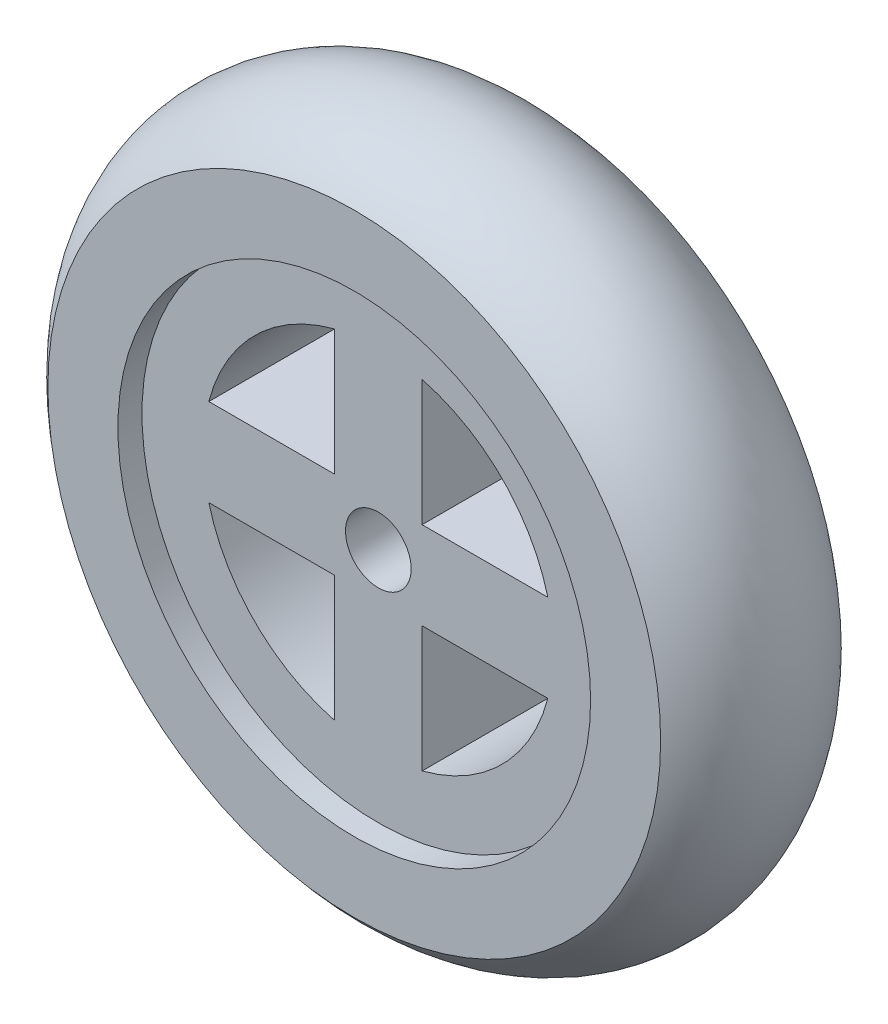
ISO-10303-21;
HEADER;
FILE_DESCRIPTION(('STEP AP214'),'2;1');
FILE_NAME('part.step','',(''),(''),'','','');
FILE_SCHEMA(('AUTOMOTIVE_DESIGN { 1 0 10303 214 1 1 1 1 }'));
ENDSEC;
DATA;
#1=APPLICATION_CONTEXT('core data for automotive mechanical design processes');
#2=APPLICATION_PROTOCOL_DEFINITION('international standard','automotive_design',2000,#1);
#3=PRODUCT_CONTEXT('',#1,'mechanical');
#4=PRODUCT('Part','Part','',(#3));
#5=PRODUCT_RELATED_PRODUCT_CATEGORY('part','',(#4));
#6=PRODUCT_DEFINITION_FORMATION('','',#4);
#7=PRODUCT_DEFINITION_CONTEXT('part definition',#1,'design');
#8=PRODUCT_DEFINITION('design','',#6,#7);
#9=PRODUCT_DEFINITION_SHAPE('','',#8);
#10=(LENGTH_UNIT() NAMED_UNIT(*) SI_UNIT(.MILLI.,.METRE.));
#11=(NAMED_UNIT(*) PLANE_ANGLE_UNIT() SI_UNIT($,.RADIAN.));
#12=(NAMED_UNIT(*) SI_UNIT($,.STERADIAN.) SOLID_ANGLE_UNIT());
#13=UNCERTAINTY_MEASURE_WITH_UNIT(LENGTH_MEASURE(1.E-05),#10,'distance_accuracy_value','');
#14=(GEOMETRIC_REPRESENTATION_CONTEXT(3) GLOBAL_UNCERTAINTY_ASSIGNED_CONTEXT((#13)) GLOBAL_UNIT_ASSIGNED_CONTEXT((#10,
#11,#12)) REPRESENTATION_CONTEXT('',''));
#15=CARTESIAN_POINT('',(0.,0.,0.));
#16=DIRECTION('',(0.,0.,1.));
#17=DIRECTION('',(1.,0.,0.));
#18=AXIS2_PLACEMENT_3D('',#15,#16,#17);
#19=CARTESIAN_POINT('',(2.44635933818074E-11,0.,7131.7252449469));
#20=DIRECTION('',(0.,0.,1.));
#21=DIRECTION('',(1.,0.,0.));
#22=AXIS2_PLACEMENT_3D('',#19,#20,#21);
#23=CYLINDRICAL_SURFACE('',#22,40.);
#24=CARTESIAN_POINT('',(0.,0.,-14.9999999999997));
#25=DIRECTION('',(0.,0.,1.));
#26=DIRECTION('',(1.,0.,0.));
#27=AXIS2_PLACEMENT_3D('',#24,#25,#26);
#28=CIRCLE('',#27,40.0000000000001);
#29=CARTESIAN_POINT('',(-10.,38.7298334620742,-15.));
#30=VERTEX_POINT('',#29);
#31=CARTESIAN_POINT('',(-38.7298334620743,10.,-14.9999999999995));
#32=VERTEX_POINT('',#31);
#33=EDGE_CURVE('E206',#30,#32,#28,.T.);
#34=ORIENTED_EDGE('',*,*,#33,.F.);
#35=DIRECTION('',(0.,0.,1.));
#36=VECTOR('',#35,1.);
#37=CARTESIAN_POINT('',(-10.,38.7298334620679,7131.7252449469));
#38=LINE('',#37,#36);
#39=CARTESIAN_POINT('',(-9.99999999999999,38.7298334620741,14.9999999999997));
#40=VERTEX_POINT('',#39);
#41=EDGE_CURVE('E255',#30,#40,#38,.T.);
#42=ORIENTED_EDGE('',*,*,#41,.T.);
#43=CARTESIAN_POINT('',(0.,0.,14.9999999999997));
#44=DIRECTION('',(0.,0.,1.));
#45=DIRECTION('',(1.,0.,0.));
#46=AXIS2_PLACEMENT_3D('',#43,#44,#45);
#47=CIRCLE('',#46,40.);
#48=CARTESIAN_POINT('',(-38.7298334620741,9.99999999999997,14.9999999999998));
#49=VERTEX_POINT('',#48);
#50=EDGE_CURVE('E211',#40,#49,#47,.T.);
#51=ORIENTED_EDGE('',*,*,#50,.T.);
#52=DIRECTION('',(0.,0.,1.));
#53=VECTOR('',#52,1.);
#54=CARTESIAN_POINT('',(-38.7298334620497,10.,7131.7252449469));
#55=LINE('',#54,#53);
#56=EDGE_CURVE('E171',#49,#32,#55,.F.);
#57=ORIENTED_EDGE('',*,*,#56,.T.);
#58=EDGE_LOOP('',(#34,#42,#51,#57));
#59=FACE_BOUND('',#58,.T.);
#60=ADVANCED_FACE('F39',(#59),#23,.F.);
#61=CARTESIAN_POINT('',(-38.7298334620741,-9.99999999999997,14.9999999999998));
#62=VERTEX_POINT('',#61);
#63=CARTESIAN_POINT('',(-10.,-38.7298334620679,15.));
#64=VERTEX_POINT('',#63);
#65=EDGE_CURVE('E208',#62,#64,#47,.T.);
#66=ORIENTED_EDGE('',*,*,#65,.T.);
#67=DIRECTION('',(0.,0.,1.));
#68=VECTOR('',#67,1.);
#69=CARTESIAN_POINT('',(-10.,-38.7298334620679,7131.7252449469));
#70=LINE('',#69,#68);
#71=CARTESIAN_POINT('',(-10.,-38.7298334620742,-14.9999999999996));
#72=VERTEX_POINT('',#71);
#73=EDGE_CURVE('E241',#64,#72,#70,.F.);
#74=ORIENTED_EDGE('',*,*,#73,.T.);
#75=CARTESIAN_POINT('',(-38.7298334620743,-10.,-15.));
#76=VERTEX_POINT('',#75);
#77=EDGE_CURVE('E144',#76,#72,#28,.T.);
#78=ORIENTED_EDGE('',*,*,#77,.F.);
#79=DIRECTION('',(0.,0.,1.));
#80=VECTOR('',#79,1.);
#81=CARTESIAN_POINT('',(-38.7298334620497,-10.,7131.7252449469));
#82=LINE('',#81,#80);
#83=EDGE_CURVE('E150',#62,#76,#82,.F.);
#84=ORIENTED_EDGE('',*,*,#83,.F.);
#85=EDGE_LOOP('',(#66,#74,#78,#84));
#86=FACE_BOUND('',#85,.T.);
#87=ADVANCED_FACE('F333',(#86),#23,.F.);
#88=CARTESIAN_POINT('',(0.,10.,0.));
#89=DIRECTION('',(0.,-1.,0.));
#90=DIRECTION('',(0.,0.,-1.));
#91=AXIS2_PLACEMENT_3D('',#88,#89,#90);
#92=PLANE('',#91);
#93=DIRECTION('',(0.,0.,1.));
#94=VECTOR('',#93,1.);
#95=CARTESIAN_POINT('',(-10.,10.,0.));
#96=LINE('',#95,#94);
#97=CARTESIAN_POINT('',(-10.,10.,-15.));
#98=VERTEX_POINT('',#97);
#99=CARTESIAN_POINT('',(-10.,10.,15.));
#100=VERTEX_POINT('',#99);
#101=EDGE_CURVE('E236',#98,#100,#96,.T.);
#102=ORIENTED_EDGE('',*,*,#101,.F.);
#103=DIRECTION('',(1.,0.,0.));
#104=VECTOR('',#103,1.);
#105=CARTESIAN_POINT('',(-40.,10.,-15.));
#106=LINE('',#105,#104);
#107=EDGE_CURVE('E167',#32,#98,#106,.T.);
#108=ORIENTED_EDGE('',*,*,#107,.F.);
#109=ORIENTED_EDGE('',*,*,#56,.F.);
#110=DIRECTION('',(1.,0.,0.));
#111=VECTOR('',#110,1.);
#112=CARTESIAN_POINT('',(-40.,10.,15.));
#113=LINE('',#112,#111);
#114=EDGE_CURVE('E157',#49,#100,#113,.T.);
#115=ORIENTED_EDGE('',*,*,#114,.T.);
#116=EDGE_LOOP('',(#102,#108,#109,#115));
#117=FACE_BOUND('',#116,.T.);
#118=ADVANCED_FACE('F290',(#117),#92,.F.);
#119=CARTESIAN_POINT('',(0.,-10.,0.));
#120=DIRECTION('',(0.,-1.,0.));
#121=DIRECTION('',(0.,0.,-1.));
#122=AXIS2_PLACEMENT_3D('',#119,#120,#121);
#123=PLANE('',#122);
#124=DIRECTION('',(1.,0.,0.));
#125=VECTOR('',#124,1.);
#126=CARTESIAN_POINT('',(-40.,-10.,-15.));
#127=LINE('',#126,#125);
#128=CARTESIAN_POINT('',(-10.,-10.,-15.));
#129=VERTEX_POINT('',#128);
#130=EDGE_CURVE('E143',#76,#129,#127,.T.);
#131=ORIENTED_EDGE('',*,*,#130,.T.);
#132=DIRECTION('',(0.,0.,1.));
#133=VECTOR('',#132,1.);
#134=CARTESIAN_POINT('',(-10.,-10.,0.));
#135=LINE('',#134,#133);
#136=CARTESIAN_POINT('',(-10.,-10.,15.));
#137=VERTEX_POINT('',#136);
#138=EDGE_CURVE('E49',#129,#137,#135,.T.);
#139=ORIENTED_EDGE('',*,*,#138,.T.);
#140=DIRECTION('',(1.,0.,0.));
#141=VECTOR('',#140,1.);
#142=CARTESIAN_POINT('',(-40.,-10.,15.));
#143=LINE('',#142,#141);
#144=EDGE_CURVE('E160',#62,#137,#143,.T.);
#145=ORIENTED_EDGE('',*,*,#144,.F.);
#146=ORIENTED_EDGE('',*,*,#83,.T.);
#147=EDGE_LOOP('',(#131,#139,#145,#146));
#148=FACE_BOUND('',#147,.T.);
#149=ADVANCED_FACE('F149',(#148),#123,.T.);
#150=DIRECTION('',(0.,0.,1.));
#151=VECTOR('',#150,1.);
#152=CARTESIAN_POINT('',(10.,38.7298334620805,7131.7252449469));
#153=LINE('',#152,#151);
#154=CARTESIAN_POINT('',(10.,38.7298334620742,-15.));
#155=VERTEX_POINT('',#154);
#156=CARTESIAN_POINT('',(10.,38.7298334620741,15.));
#157=VERTEX_POINT('',#156);
#158=EDGE_CURVE('E224',#155,#157,#153,.T.);
#159=ORIENTED_EDGE('',*,*,#158,.F.);
#160=CARTESIAN_POINT('',(38.7298334620742,10.,-14.9999999999998));
#161=VERTEX_POINT('',#160);
#162=EDGE_CURVE('E207',#161,#155,#28,.T.);
#163=ORIENTED_EDGE('',*,*,#162,.F.);
#164=DIRECTION('',(0.,0.,1.));
#165=VECTOR('',#164,1.);
#166=CARTESIAN_POINT('',(38.7298334620986,10.,7131.7252449469));
#167=LINE('',#166,#165);
#168=CARTESIAN_POINT('',(38.7298334620742,10.,14.9999999999995));
#169=VERTEX_POINT('',#168);
#170=EDGE_CURVE('E175',#161,#169,#167,.T.);
#171=ORIENTED_EDGE('',*,*,#170,.T.);
#172=EDGE_CURVE('E136',#169,#157,#47,.T.);
#173=ORIENTED_EDGE('',*,*,#172,.T.);
#174=EDGE_LOOP('',(#159,#163,#171,#173));
#175=FACE_BOUND('',#174,.T.);
#176=ADVANCED_FACE('F222',(#175),#23,.F.);
#177=CARTESIAN_POINT('',(54.,0.,15.));
#178=DIRECTION('',(0.,0.,1.));
#179=DIRECTION('',(1.,0.,0.));
#180=AXIS2_PLACEMENT_3D('',#177,#178,#179);
#181=PLANE('',#180);
#182=CARTESIAN_POINT('',(0.,0.,15.0000000000002));
#183=DIRECTION('',(0.,0.,1.));
#184=DIRECTION('',(1.,0.,0.));
#185=AXIS2_PLACEMENT_3D('',#182,#183,#184);
#186=CIRCLE('',#185,7.5);
#187=CARTESIAN_POINT('',(7.5,0.,15.0000000000002));
#188=VERTEX_POINT('',#187);
#189=EDGE_CURVE('E250',#188,#188,#186,.T.);
#190=ORIENTED_EDGE('',*,*,#189,.F.);
#191=EDGE_LOOP('',(#190));
#192=FACE_BOUND('',#191,.T.);
#193=DIRECTION('',(0.,-1.,0.));
#194=VECTOR('',#193,1.);
#195=CARTESIAN_POINT('',(10.,40.,15.));
#196=LINE('',#195,#194);
#197=CARTESIAN_POINT('',(10.,10.,15.));
#198=VERTEX_POINT('',#197);
#199=EDGE_CURVE('E232',#157,#198,#196,.T.);
#200=ORIENTED_EDGE('',*,*,#199,.F.);
#201=ORIENTED_EDGE('',*,*,#172,.F.);
#202=EDGE_CURVE('E152',#198,#169,#113,.T.);
#203=ORIENTED_EDGE('',*,*,#202,.F.);
#204=EDGE_LOOP('',(#200,#201,#203));
#205=FACE_BOUND('',#204,.T.);
#206=ORIENTED_EDGE('',*,*,#50,.F.);
#207=DIRECTION('',(0.,-1.,0.));
#208=VECTOR('',#207,1.);
#209=CARTESIAN_POINT('',(-10.,40.,15.));
#210=LINE('',#209,#208);
#211=EDGE_CURVE('E56',#40,#100,#210,.T.);
#212=ORIENTED_EDGE('',*,*,#211,.T.);
#213=ORIENTED_EDGE('',*,*,#114,.F.);
#214=EDGE_LOOP('',(#206,#212,#213));
#215=FACE_BOUND('',#214,.T.);
#216=CARTESIAN_POINT('',(10.,-38.7298334620805,15.));
#217=VERTEX_POINT('',#216);
#218=CARTESIAN_POINT('',(38.7298334620742,-10.,15.));
#219=VERTEX_POINT('',#218);
#220=EDGE_CURVE('E212',#217,#219,#47,.T.);
#221=ORIENTED_EDGE('',*,*,#220,.F.);
#222=CARTESIAN_POINT('',(10.,-10.,15.));
#223=VERTEX_POINT('',#222);
#224=EDGE_CURVE('E237',#223,#217,#196,.T.);
#225=ORIENTED_EDGE('',*,*,#224,.F.);
#226=EDGE_CURVE('E265',#223,#219,#143,.T.);
#227=ORIENTED_EDGE('',*,*,#226,.T.);
#228=EDGE_LOOP('',(#221,#225,#227));
#229=FACE_BOUND('',#228,.T.);
#230=EDGE_CURVE('E130',#137,#64,#210,.T.);
#231=ORIENTED_EDGE('',*,*,#230,.T.);
#232=ORIENTED_EDGE('',*,*,#65,.F.);
#233=ORIENTED_EDGE('',*,*,#144,.T.);
#234=EDGE_LOOP('',(#231,#232,#233));
#235=FACE_BOUND('',#234,.T.);
#236=CARTESIAN_POINT('',(0.,0.,14.9999999999997));
#237=DIRECTION('',(0.,0.,1.));
#238=DIRECTION('',(1.,0.,0.));
#239=AXIS2_PLACEMENT_3D('',#236,#237,#238);
#240=CIRCLE('',#239,54.);
#241=CARTESIAN_POINT('',(54.,0.,14.9999999999995));
#242=VERTEX_POINT('',#241);
#243=EDGE_CURVE('E179',#242,#242,#240,.T.);
#244=ORIENTED_EDGE('',*,*,#243,.T.);
#245=EDGE_LOOP('',(#244));
#246=FACE_BOUND('',#245,.T.);
#247=ADVANCED_FACE('F41',(#192,#205,#215,#229,#235,#246),#181,.T.);
#248=DIRECTION('',(0.,0.,1.));
#249=VECTOR('',#248,1.);
#250=CARTESIAN_POINT('',(10.,-38.7298334620805,7131.7252449469));
#251=LINE('',#250,#249);
#252=CARTESIAN_POINT('',(10.,-38.7298334620742,-15.));
#253=VERTEX_POINT('',#252);
#254=EDGE_CURVE('E261',#217,#253,#251,.F.);
#255=ORIENTED_EDGE('',*,*,#254,.F.);
#256=ORIENTED_EDGE('',*,*,#220,.T.);
#257=DIRECTION('',(0.,0.,1.));
#258=VECTOR('',#257,1.);
#259=CARTESIAN_POINT('',(38.7298334620986,-10.,7131.7252449469));
#260=LINE('',#259,#258);
#261=CARTESIAN_POINT('',(38.7298334620742,-10.,-14.9999999999998));
#262=VERTEX_POINT('',#261);
#263=EDGE_CURVE('E166',#262,#219,#260,.T.);
#264=ORIENTED_EDGE('',*,*,#263,.F.);
#265=EDGE_CURVE('E203',#253,#262,#28,.T.);
#266=ORIENTED_EDGE('',*,*,#265,.F.);
#267=EDGE_LOOP('',(#255,#256,#264,#266));
#268=FACE_BOUND('',#267,.T.);
#269=ADVANCED_FACE('F305',(#268),#23,.F.);
#270=CARTESIAN_POINT('',(40.,0.,-14.9999999999999));
#271=DIRECTION('',(0.,0.,-1.));
#272=DIRECTION('',(-1.,0.,0.));
#273=AXIS2_PLACEMENT_3D('',#270,#271,#272);
#274=PLANE('',#273);
#275=CARTESIAN_POINT('',(0.,0.,-14.9999999999998));
#276=DIRECTION('',(0.,0.,-1.));
#277=DIRECTION('',(-1.,0.,0.));
#278=AXIS2_PLACEMENT_3D('',#275,#276,#277);
#279=CIRCLE('',#278,7.5);
#280=CARTESIAN_POINT('',(-7.5,0.,-14.9999999999998));
#281=VERTEX_POINT('',#280);
#282=EDGE_CURVE('E43',#281,#281,#279,.T.);
#283=ORIENTED_EDGE('',*,*,#282,.F.);
#284=EDGE_LOOP('',(#283));
#285=FACE_BOUND('',#284,.T.);
#286=DIRECTION('',(0.,1.,0.));
#287=VECTOR('',#286,1.);
#288=CARTESIAN_POINT('',(-10.,40.,-15.));
#289=LINE('',#288,#287);
#290=EDGE_CURVE('E146',#98,#30,#289,.T.);
#291=ORIENTED_EDGE('',*,*,#290,.T.);
#292=ORIENTED_EDGE('',*,*,#33,.T.);
#293=ORIENTED_EDGE('',*,*,#107,.T.);
#294=EDGE_LOOP('',(#291,#292,#293));
#295=FACE_BOUND('',#294,.T.);
#296=DIRECTION('',(0.,1.,0.));
#297=VECTOR('',#296,1.);
#298=CARTESIAN_POINT('',(10.,40.,-15.));
#299=LINE('',#298,#297);
#300=CARTESIAN_POINT('',(10.,-10.,-15.));
#301=VERTEX_POINT('',#300);
#302=EDGE_CURVE('E243',#253,#301,#299,.T.);
#303=ORIENTED_EDGE('',*,*,#302,.F.);
#304=ORIENTED_EDGE('',*,*,#265,.T.);
#305=EDGE_CURVE('E153',#301,#262,#127,.T.);
#306=ORIENTED_EDGE('',*,*,#305,.F.);
#307=EDGE_LOOP('',(#303,#304,#306));
#308=FACE_BOUND('',#307,.T.);
#309=ORIENTED_EDGE('',*,*,#162,.T.);
#310=CARTESIAN_POINT('',(10.,10.,-15.));
#311=VERTEX_POINT('',#310);
#312=EDGE_CURVE('E245',#311,#155,#299,.T.);
#313=ORIENTED_EDGE('',*,*,#312,.F.);
#314=EDGE_CURVE('E267',#311,#161,#106,.T.);
#315=ORIENTED_EDGE('',*,*,#314,.T.);
#316=EDGE_LOOP('',(#309,#313,#315));
#317=FACE_BOUND('',#316,.T.);
#318=ORIENTED_EDGE('',*,*,#77,.T.);
#319=EDGE_CURVE('E64',#72,#129,#289,.T.);
#320=ORIENTED_EDGE('',*,*,#319,.T.);
#321=ORIENTED_EDGE('',*,*,#130,.F.);
#322=EDGE_LOOP('',(#318,#320,#321));
#323=FACE_BOUND('',#322,.T.);
#324=CARTESIAN_POINT('',(0.,0.,-14.9999999999997));
#325=DIRECTION('',(0.,0.,1.));
#326=DIRECTION('',(1.,0.,0.));
#327=AXIS2_PLACEMENT_3D('',#324,#325,#326);
#328=CIRCLE('',#327,54.0000000000001);
#329=CARTESIAN_POINT('',(54.,0.,-14.9999999999999));
#330=VERTEX_POINT('',#329);
#331=EDGE_CURVE('E199',#330,#330,#328,.T.);
#332=ORIENTED_EDGE('',*,*,#331,.F.);
#333=EDGE_LOOP('',(#332));
#334=FACE_BOUND('',#333,.T.);
#335=ADVANCED_FACE('F141',(#285,#295,#308,#317,#323,#334),#274,.T.);
#336=CARTESIAN_POINT('',(2.44635933818074E-11,0.,7131.7252449469));
#337=DIRECTION('',(0.,0.,1.));
#338=DIRECTION('',(1.,0.,0.));
#339=AXIS2_PLACEMENT_3D('',#336,#337,#338);
#340=CYLINDRICAL_SURFACE('',#339,54.0000000000001);
#341=ORIENTED_EDGE('',*,*,#331,.T.);
#342=EDGE_LOOP('',(#341));
#343=FACE_BOUND('',#342,.T.);
#344=CARTESIAN_POINT('',(0.,0.,-20.5000000000002));
#345=DIRECTION('',(0.,0.,1.));
#346=DIRECTION('',(1.,0.,0.));
#347=AXIS2_PLACEMENT_3D('',#344,#345,#346);
#348=CIRCLE('',#347,54.0000000000001);
#349=CARTESIAN_POINT('',(54.,0.,-20.5000000000004));
#350=VERTEX_POINT('',#349);
#351=EDGE_CURVE('E195',#350,#350,#348,.T.);
#352=ORIENTED_EDGE('',*,*,#351,.F.);
#353=EDGE_LOOP('',(#352));
#354=FACE_BOUND('',#353,.T.);
#355=ADVANCED_FACE('F344',(#343,#354),#340,.F.);
#356=CARTESIAN_POINT('',(54.,0.,-20.4999999999999));
#357=DIRECTION('',(0.,0.,-1.));
#358=DIRECTION('',(-1.,0.,0.));
#359=AXIS2_PLACEMENT_3D('',#356,#357,#358);
#360=PLANE('',#359);
#361=ORIENTED_EDGE('',*,*,#351,.T.);
#362=EDGE_LOOP('',(#361));
#363=FACE_BOUND('',#362,.T.);
#364=CARTESIAN_POINT('',(0.,0.,-20.5000000000002));
#365=DIRECTION('',(0.,0.,1.));
#366=DIRECTION('',(1.,0.,0.));
#367=AXIS2_PLACEMENT_3D('',#364,#365,#366);
#368=CIRCLE('',#367,70.0000000000001);
#369=CARTESIAN_POINT('',(70.,0.,-20.5000000000004));
#370=VERTEX_POINT('',#369);
#371=EDGE_CURVE('E191',#370,#370,#368,.T.);
#372=ORIENTED_EDGE('',*,*,#371,.F.);
#373=EDGE_LOOP('',(#372));
#374=FACE_BOUND('',#373,.T.);
#375=ADVANCED_FACE('F442',(#363,#374),#360,.T.);
#376=CARTESIAN_POINT('',(0.,0.,0.));
#377=DIRECTION('',(0.,0.,1.));
#378=DIRECTION('',(1.,0.,0.));
#379=AXIS2_PLACEMENT_3D('',#376,#377,#378);
#380=TOROIDAL_SURFACE('',#379,54.0078144082805,26.);
#381=ORIENTED_EDGE('',*,*,#371,.T.);
#382=EDGE_LOOP('',(#381));
#383=FACE_BOUND('',#382,.T.);
#384=CARTESIAN_POINT('',(0.,0.,20.5000000000002));
#385=DIRECTION('',(0.,0.,1.));
#386=DIRECTION('',(1.,0.,0.));
#387=AXIS2_PLACEMENT_3D('',#384,#385,#386);
#388=CIRCLE('',#387,70.);
#389=CARTESIAN_POINT('',(70.,0.,20.4999999999999));
#390=VERTEX_POINT('',#389);
#391=EDGE_CURVE('E187',#390,#390,#388,.T.);
#392=ORIENTED_EDGE('',*,*,#391,.F.);
#393=EDGE_LOOP('',(#392));
#394=FACE_BOUND('',#393,.T.);
#395=ADVANCED_FACE('F328',(#383,#394),#380,.T.);
#396=CARTESIAN_POINT('',(70.,0.,20.5));
#397=DIRECTION('',(0.,0.,1.));
#398=DIRECTION('',(1.,0.,0.));
#399=AXIS2_PLACEMENT_3D('',#396,#397,#398);
#400=PLANE('',#399);
#401=ORIENTED_EDGE('',*,*,#391,.T.);
#402=EDGE_LOOP('',(#401));
#403=FACE_BOUND('',#402,.T.);
#404=CARTESIAN_POINT('',(0.,0.,20.5000000000002));
#405=DIRECTION('',(0.,0.,1.));
#406=DIRECTION('',(1.,0.,0.));
#407=AXIS2_PLACEMENT_3D('',#404,#405,#406);
#408=CIRCLE('',#407,53.9999999999999);
#409=CARTESIAN_POINT('',(54.,0.,20.5));
#410=VERTEX_POINT('',#409);
#411=EDGE_CURVE('E183',#410,#410,#408,.T.);
#412=ORIENTED_EDGE('',*,*,#411,.F.);
#413=EDGE_LOOP('',(#412));
#414=FACE_BOUND('',#413,.T.);
#415=ADVANCED_FACE('F319',(#403,#414),#400,.T.);
#416=CARTESIAN_POINT('',(2.44635933818074E-11,0.,7131.7252449469));
#417=DIRECTION('',(0.,0.,1.));
#418=DIRECTION('',(1.,0.,0.));
#419=AXIS2_PLACEMENT_3D('',#416,#417,#418);
#420=CYLINDRICAL_SURFACE('',#419,54.);
#421=ORIENTED_EDGE('',*,*,#411,.T.);
#422=EDGE_LOOP('',(#421));
#423=FACE_BOUND('',#422,.T.);
#424=ORIENTED_EDGE('',*,*,#243,.F.);
#425=EDGE_LOOP('',(#424));
#426=FACE_BOUND('',#425,.T.);
#427=ADVANCED_FACE('F317',(#423,#426),#420,.F.);
#428=ORIENTED_EDGE('',*,*,#314,.F.);
#429=DIRECTION('',(0.,0.,1.));
#430=VECTOR('',#429,1.);
#431=CARTESIAN_POINT('',(10.,10.,0.));
#432=LINE('',#431,#430);
#433=EDGE_CURVE('E258',#311,#198,#432,.T.);
#434=ORIENTED_EDGE('',*,*,#433,.T.);
#435=ORIENTED_EDGE('',*,*,#202,.T.);
#436=ORIENTED_EDGE('',*,*,#170,.F.);
#437=EDGE_LOOP('',(#428,#434,#435,#436));
#438=FACE_BOUND('',#437,.T.);
#439=ADVANCED_FACE('F278',(#438),#92,.F.);
#440=DIRECTION('',(0.,0.,1.));
#441=VECTOR('',#440,1.);
#442=CARTESIAN_POINT('',(10.,-10.,0.));
#443=LINE('',#442,#441);
#444=EDGE_CURVE('E11',#301,#223,#443,.T.);
#445=ORIENTED_EDGE('',*,*,#444,.F.);
#446=ORIENTED_EDGE('',*,*,#305,.T.);
#447=ORIENTED_EDGE('',*,*,#263,.T.);
#448=ORIENTED_EDGE('',*,*,#226,.F.);
#449=EDGE_LOOP('',(#445,#446,#447,#448));
#450=FACE_BOUND('',#449,.T.);
#451=ADVANCED_FACE('F303',(#450),#123,.T.);
#452=CARTESIAN_POINT('',(-10.,0.,0.));
#453=DIRECTION('',(1.,0.,0.));
#454=DIRECTION('',(0.,0.,-1.));
#455=AXIS2_PLACEMENT_3D('',#452,#453,#454);
#456=PLANE('',#455);
#457=ORIENTED_EDGE('',*,*,#73,.F.);
#458=ORIENTED_EDGE('',*,*,#230,.F.);
#459=ORIENTED_EDGE('',*,*,#138,.F.);
#460=ORIENTED_EDGE('',*,*,#319,.F.);
#461=EDGE_LOOP('',(#457,#458,#459,#460));
#462=FACE_BOUND('',#461,.T.);
#463=ADVANCED_FACE('F128',(#462),#456,.F.);
#464=CARTESIAN_POINT('',(10.,0.,0.));
#465=DIRECTION('',(1.,0.,0.));
#466=DIRECTION('',(0.,0.,-1.));
#467=AXIS2_PLACEMENT_3D('',#464,#465,#466);
#468=PLANE('',#467);
#469=ORIENTED_EDGE('',*,*,#224,.T.);
#470=ORIENTED_EDGE('',*,*,#254,.T.);
#471=ORIENTED_EDGE('',*,*,#302,.T.);
#472=ORIENTED_EDGE('',*,*,#444,.T.);
#473=EDGE_LOOP('',(#469,#470,#471,#472));
#474=FACE_BOUND('',#473,.T.);
#475=ADVANCED_FACE('F356',(#474),#468,.T.);
#476=ORIENTED_EDGE('',*,*,#312,.T.);
#477=ORIENTED_EDGE('',*,*,#158,.T.);
#478=ORIENTED_EDGE('',*,*,#199,.T.);
#479=ORIENTED_EDGE('',*,*,#433,.F.);
#480=EDGE_LOOP('',(#476,#477,#478,#479));
#481=FACE_BOUND('',#480,.T.);
#482=ADVANCED_FACE('F279',(#481),#468,.T.);
#483=ORIENTED_EDGE('',*,*,#41,.F.);
#484=ORIENTED_EDGE('',*,*,#290,.F.);
#485=ORIENTED_EDGE('',*,*,#101,.T.);
#486=ORIENTED_EDGE('',*,*,#211,.F.);
#487=EDGE_LOOP('',(#483,#484,#485,#486));
#488=FACE_BOUND('',#487,.T.);
#489=ADVANCED_FACE('F291',(#488),#456,.F.);
#490=CARTESIAN_POINT('',(0.,0.,-20.5000000000004));
#491=DIRECTION('',(0.,0.,1.));
#492=DIRECTION('',(1.,0.,0.));
#493=AXIS2_PLACEMENT_3D('',#490,#491,#492);
#494=CYLINDRICAL_SURFACE('',#493,7.5);
#495=ORIENTED_EDGE('',*,*,#189,.T.);
#496=EDGE_LOOP('',(#495));
#497=FACE_BOUND('',#496,.T.);
#498=ORIENTED_EDGE('',*,*,#282,.T.);
#499=EDGE_LOOP('',(#498));
#500=FACE_BOUND('',#499,.T.);
#501=ADVANCED_FACE('F364',(#497,#500),#494,.F.);
#502=CLOSED_SHELL('',(#60,#87,#118,#149,#176,#247,#269,#335,#355,#375,#395,#415,#427,#439,#451,
#463,#475,#482,#489,#501));
#503=MANIFOLD_SOLID_BREP('B2',#502);
#504=ADVANCED_BREP_SHAPE_REPRESENTATION('',(#18,#503),#14);
#505=SHAPE_DEFINITION_REPRESENTATION(#9,#504);
ENDSEC;
END-ISO-10303-21;
